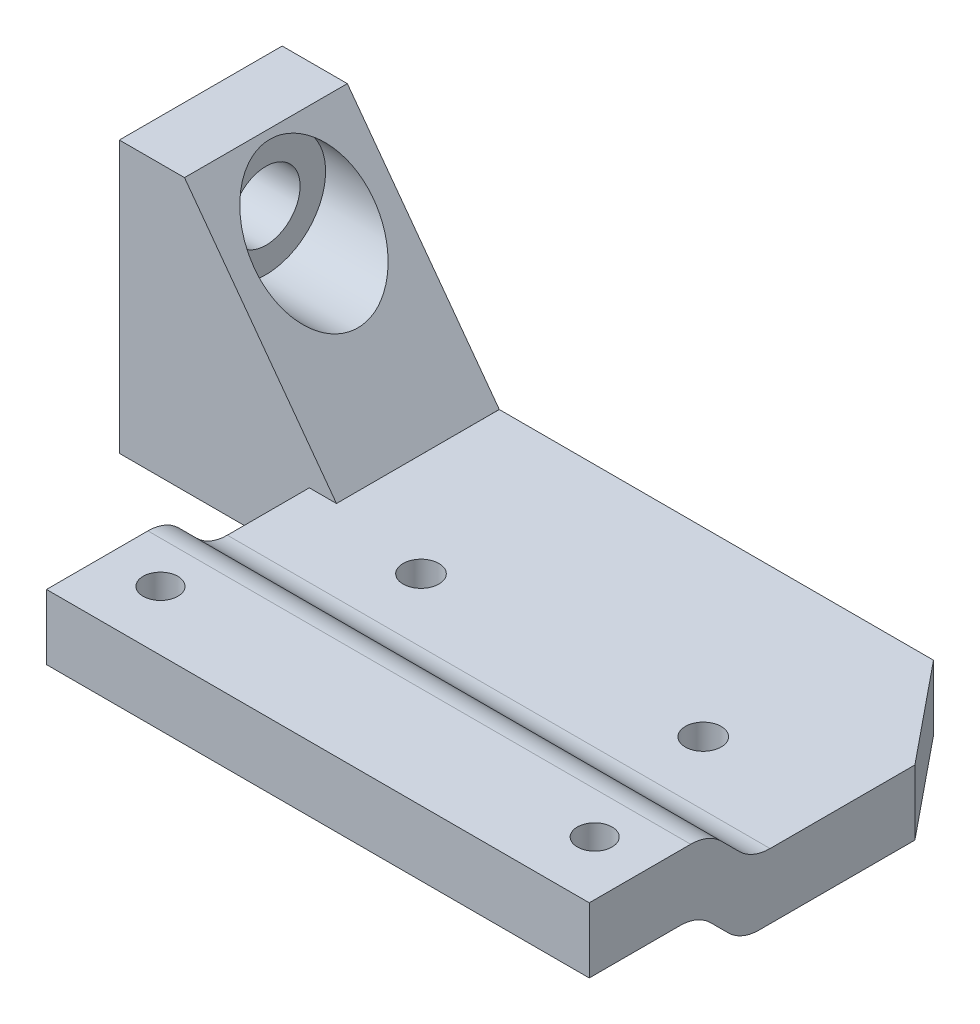
ISO-10303-21;
HEADER;
FILE_DESCRIPTION(('STEP AP214'),'2;1');
FILE_NAME('part.step','',(''),(''),'','','');
FILE_SCHEMA(('AUTOMOTIVE_DESIGN { 1 0 10303 214 1 1 1 1 }'));
ENDSEC;
DATA;
#1=APPLICATION_CONTEXT('core data for automotive mechanical design processes');
#2=APPLICATION_PROTOCOL_DEFINITION('international standard','automotive_design',2000,#1);
#3=PRODUCT_CONTEXT('',#1,'mechanical');
#4=PRODUCT('Part','Part','',(#3));
#5=PRODUCT_RELATED_PRODUCT_CATEGORY('part','',(#4));
#6=PRODUCT_DEFINITION_FORMATION('','',#4);
#7=PRODUCT_DEFINITION_CONTEXT('part definition',#1,'design');
#8=PRODUCT_DEFINITION('design','',#6,#7);
#9=PRODUCT_DEFINITION_SHAPE('','',#8);
#10=(LENGTH_UNIT() NAMED_UNIT(*) SI_UNIT(.MILLI.,.METRE.));
#11=(NAMED_UNIT(*) PLANE_ANGLE_UNIT() SI_UNIT($,.RADIAN.));
#12=(NAMED_UNIT(*) SI_UNIT($,.STERADIAN.) SOLID_ANGLE_UNIT());
#13=UNCERTAINTY_MEASURE_WITH_UNIT(LENGTH_MEASURE(1.E-05),#10,'distance_accuracy_value','');
#14=(GEOMETRIC_REPRESENTATION_CONTEXT(3) GLOBAL_UNCERTAINTY_ASSIGNED_CONTEXT((#13)) GLOBAL_UNIT_ASSIGNED_CONTEXT((#10,
#11,#12)) REPRESENTATION_CONTEXT('',''));
#15=CARTESIAN_POINT('',(0.,0.,0.));
#16=DIRECTION('',(0.,0.,1.));
#17=DIRECTION('',(1.,0.,0.));
#18=AXIS2_PLACEMENT_3D('',#15,#16,#17);
#19=CARTESIAN_POINT('',(0.,6.,0.));
#20=DIRECTION('',(0.,1.,0.));
#21=DIRECTION('',(0.,0.,1.));
#22=AXIS2_PLACEMENT_3D('',#19,#20,#21);
#23=PLANE('',#22);
#24=CARTESIAN_POINT('',(13.,6.,0.));
#25=DIRECTION('',(0.,1.,0.));
#26=DIRECTION('',(0.,0.,1.));
#27=AXIS2_PLACEMENT_3D('',#24,#25,#26);
#28=CIRCLE('',#27,1.65);
#29=CARTESIAN_POINT('',(13.,6.,1.65));
#30=VERTEX_POINT('',#29);
#31=EDGE_CURVE('E253',#30,#30,#28,.T.);
#32=ORIENTED_EDGE('',*,*,#31,.F.);
#33=EDGE_LOOP('',(#32));
#34=FACE_BOUND('',#33,.T.);
#35=CARTESIAN_POINT('',(-13.,6.,0.));
#36=DIRECTION('',(0.,1.,0.));
#37=DIRECTION('',(0.,0.,1.));
#38=AXIS2_PLACEMENT_3D('',#35,#36,#37);
#39=CIRCLE('',#38,1.65);
#40=CARTESIAN_POINT('',(-13.,6.,1.65));
#41=VERTEX_POINT('',#40);
#42=EDGE_CURVE('E257',#41,#41,#39,.T.);
#43=ORIENTED_EDGE('',*,*,#42,.F.);
#44=EDGE_LOOP('',(#43));
#45=FACE_BOUND('',#44,.T.);
#46=DIRECTION('',(0.,0.,1.));
#47=VECTOR('',#46,1.);
#48=CARTESIAN_POINT('',(-25.,6.,0.));
#49=LINE('',#48,#47);
#50=CARTESIAN_POINT('',(-25.,6.,-1.71166189043959));
#51=VERTEX_POINT('',#50);
#52=CARTESIAN_POINT('',(-25.,6.,5.84314575050763));
#53=VERTEX_POINT('',#52);
#54=EDGE_CURVE('E237',#51,#53,#49,.T.);
#55=ORIENTED_EDGE('',*,*,#54,.T.);
#56=DIRECTION('',(1.,0.,0.));
#57=VECTOR('',#56,1.);
#58=CARTESIAN_POINT('',(25.,6.,5.84314575050762));
#59=LINE('',#58,#57);
#60=CARTESIAN_POINT('',(25.,6.,5.84314575050762));
#61=VERTEX_POINT('',#60);
#62=EDGE_CURVE('E358',#53,#61,#59,.T.);
#63=ORIENTED_EDGE('',*,*,#62,.T.);
#64=DIRECTION('',(0.,0.,1.));
#65=VECTOR('',#64,1.);
#66=CARTESIAN_POINT('',(25.,6.,0.));
#67=LINE('',#66,#65);
#68=CARTESIAN_POINT('',(25.,6.,-7.5));
#69=VERTEX_POINT('',#68);
#70=EDGE_CURVE('E241',#69,#61,#67,.T.);
#71=ORIENTED_EDGE('',*,*,#70,.F.);
#72=DIRECTION('',(0.63137953476849,0.,0.775473973177388));
#73=VECTOR('',#72,1.);
#74=CARTESIAN_POINT('',(18.7061350499617,6.,-15.2302607871789));
#75=LINE('',#74,#73);
#76=CARTESIAN_POINT('',(17.5,6.,-16.7116618904396));
#77=VERTEX_POINT('',#76);
#78=EDGE_CURVE('E246',#77,#69,#75,.T.);
#79=ORIENTED_EDGE('',*,*,#78,.F.);
#80=DIRECTION('',(1.,0.,0.));
#81=VECTOR('',#80,1.);
#82=CARTESIAN_POINT('',(0.,6.,-16.7116618904396));
#83=LINE('',#82,#81);
#84=CARTESIAN_POINT('',(-22.5000000000013,6.,-16.7116618904396));
#85=VERTEX_POINT('',#84);
#86=EDGE_CURVE('E250',#85,#77,#83,.T.);
#87=ORIENTED_EDGE('',*,*,#86,.F.);
#88=DIRECTION('',(0.,0.,1.));
#89=VECTOR('',#88,1.);
#90=CARTESIAN_POINT('',(-22.5000000000013,6.,0.));
#91=LINE('',#90,#89);
#92=CARTESIAN_POINT('',(-22.498631959725,6.,-1.71166189043959));
#93=VERTEX_POINT('',#92);
#94=EDGE_CURVE('E234',#85,#93,#91,.T.);
#95=ORIENTED_EDGE('',*,*,#94,.T.);
#96=DIRECTION('',(-1.,0.,0.));
#97=VECTOR('',#96,1.);
#98=CARTESIAN_POINT('',(0.,6.,-1.71166189043959));
#99=LINE('',#98,#97);
#100=EDGE_CURVE('E267',#93,#51,#99,.T.);
#101=ORIENTED_EDGE('',*,*,#100,.T.);
#102=EDGE_LOOP('',(#55,#63,#71,#79,#87,#95,#101));
#103=FACE_BOUND('',#102,.T.);
#104=ADVANCED_FACE('F46',(#34,#45,#103),#23,.T.);
#105=CARTESIAN_POINT('',(0.,6.,-1.71166189043959));
#106=DIRECTION('',(0.,0.,-1.));
#107=DIRECTION('',(-1.,0.,0.));
#108=AXIS2_PLACEMENT_3D('',#105,#106,#107);
#109=PLANE('',#108);
#110=ORIENTED_EDGE('',*,*,#100,.F.);
#111=DIRECTION('',(0.59319903804985,-0.805055837353368,0.));
#112=VECTOR('',#111,1.);
#113=CARTESIAN_POINT('',(-36.498631959725,25.,-1.71166189043959));
#114=LINE('',#113,#112);
#115=CARTESIAN_POINT('',(-36.498631959725,25.,-1.71166189043959));
#116=VERTEX_POINT('',#115);
#117=EDGE_CURVE('E212',#116,#93,#114,.T.);
#118=ORIENTED_EDGE('',*,*,#117,.F.);
#119=DIRECTION('',(-1.,0.,0.));
#120=VECTOR('',#119,1.);
#121=CARTESIAN_POINT('',(-22.5000000000013,25.,-1.71166189043959));
#122=LINE('',#121,#120);
#123=CARTESIAN_POINT('',(-42.5000000000013,25.,-1.71166189043959));
#124=VERTEX_POINT('',#123);
#125=EDGE_CURVE('E231',#116,#124,#122,.T.);
#126=ORIENTED_EDGE('',*,*,#125,.T.);
#127=DIRECTION('',(0.,-1.,0.));
#128=VECTOR('',#127,1.);
#129=CARTESIAN_POINT('',(-42.5000000000013,6.,-1.71166189043959));
#130=LINE('',#129,#128);
#131=CARTESIAN_POINT('',(-42.5000000000013,0.,-1.71166189043959));
#132=VERTEX_POINT('',#131);
#133=EDGE_CURVE('E261',#124,#132,#130,.T.);
#134=ORIENTED_EDGE('',*,*,#133,.T.);
#135=DIRECTION('',(1.,0.,0.));
#136=VECTOR('',#135,1.);
#137=CARTESIAN_POINT('',(0.,0.,-1.71166189043959));
#138=LINE('',#137,#136);
#139=CARTESIAN_POINT('',(-25.,0.,-1.71166189043959));
#140=VERTEX_POINT('',#139);
#141=EDGE_CURVE('E262',#132,#140,#138,.T.);
#142=ORIENTED_EDGE('',*,*,#141,.T.);
#143=DIRECTION('',(0.,-1.,0.));
#144=VECTOR('',#143,1.);
#145=CARTESIAN_POINT('',(-25.,6.,-1.71166189043959));
#146=LINE('',#145,#144);
#147=EDGE_CURVE('E304',#51,#140,#146,.T.);
#148=ORIENTED_EDGE('',*,*,#147,.F.);
#149=EDGE_LOOP('',(#110,#118,#126,#134,#142,#148));
#150=FACE_BOUND('',#149,.T.);
#151=ADVANCED_FACE('F410',(#150),#109,.F.);
#152=CARTESIAN_POINT('',(-25.,6.,0.));
#153=DIRECTION('',(1.,0.,0.));
#154=DIRECTION('',(0.,0.,-1.));
#155=AXIS2_PLACEMENT_3D('',#152,#153,#154);
#156=PLANE('',#155);
#157=DIRECTION('',(0.,0.,1.));
#158=VECTOR('',#157,1.);
#159=CARTESIAN_POINT('',(-25.,0.,0.));
#160=LINE('',#159,#158);
#161=CARTESIAN_POINT('',(-25.,0.,6.84314575050762));
#162=VERTEX_POINT('',#161);
#163=EDGE_CURVE('E266',#140,#162,#160,.T.);
#164=ORIENTED_EDGE('',*,*,#163,.T.);
#165=CARTESIAN_POINT('',(-25.,4.,6.84314575050762));
#166=DIRECTION('',(1.,0.,0.));
#167=DIRECTION('',(0.,0.,-1.));
#168=AXIS2_PLACEMENT_3D('',#165,#166,#167);
#169=CIRCLE('',#168,4.);
#170=CARTESIAN_POINT('',(-25.,1.17157287525382,9.67157287525381));
#171=VERTEX_POINT('',#170);
#172=EDGE_CURVE('E381',#162,#171,#169,.F.);
#173=ORIENTED_EDGE('',*,*,#172,.T.);
#174=DIRECTION('',(0.,-0.707106781186549,-0.707106781186546));
#175=VECTOR('',#174,1.);
#176=CARTESIAN_POINT('',(-25.,0.,8.5));
#177=LINE('',#176,#175);
#178=CARTESIAN_POINT('',(-25.,2.82842712474619,11.3284271247462));
#179=VERTEX_POINT('',#178);
#180=EDGE_CURVE('E368',#171,#179,#177,.F.);
#181=ORIENTED_EDGE('',*,*,#180,.T.);
#182=CARTESIAN_POINT('',(-25.,0.,14.1568542494924));
#183=DIRECTION('',(1.,0.,0.));
#184=DIRECTION('',(0.,0.,-1.));
#185=AXIS2_PLACEMENT_3D('',#182,#183,#184);
#186=CIRCLE('',#185,4.);
#187=CARTESIAN_POINT('',(-25.,4.,14.1568542494924));
#188=VERTEX_POINT('',#187);
#189=EDGE_CURVE('E55',#179,#188,#186,.T.);
#190=ORIENTED_EDGE('',*,*,#189,.T.);
#191=DIRECTION('',(0.,0.,-1.));
#192=VECTOR('',#191,1.);
#193=CARTESIAN_POINT('',(-25.,4.,12.5));
#194=LINE('',#193,#192);
#195=CARTESIAN_POINT('',(-25.,4.,22.5));
#196=VERTEX_POINT('',#195);
#197=EDGE_CURVE('E169',#196,#188,#194,.T.);
#198=ORIENTED_EDGE('',*,*,#197,.F.);
#199=DIRECTION('',(0.,-1.,0.));
#200=VECTOR('',#199,1.);
#201=CARTESIAN_POINT('',(-25.,9.99999999999999,22.5));
#202=LINE('',#201,#200);
#203=CARTESIAN_POINT('',(-25.,9.99999999999999,22.5));
#204=VERTEX_POINT('',#203);
#205=EDGE_CURVE('E181',#204,#196,#202,.T.);
#206=ORIENTED_EDGE('',*,*,#205,.F.);
#207=DIRECTION('',(0.,0.,-1.));
#208=VECTOR('',#207,1.);
#209=CARTESIAN_POINT('',(-25.,9.99999999999999,22.5));
#210=LINE('',#209,#208);
#211=CARTESIAN_POINT('',(-25.,9.99999999999999,13.1568542494924));
#212=VERTEX_POINT('',#211);
#213=EDGE_CURVE('E189',#204,#212,#210,.T.);
#214=ORIENTED_EDGE('',*,*,#213,.T.);
#215=CARTESIAN_POINT('',(-25.,5.99999999999999,13.1568542494924));
#216=DIRECTION('',(1.,0.,0.));
#217=DIRECTION('',(0.,0.,-1.));
#218=AXIS2_PLACEMENT_3D('',#215,#216,#217);
#219=CIRCLE('',#218,4.);
#220=CARTESIAN_POINT('',(-25.,8.82842712474618,10.3284271247462));
#221=VERTEX_POINT('',#220);
#222=EDGE_CURVE('E346',#212,#221,#219,.F.);
#223=ORIENTED_EDGE('',*,*,#222,.T.);
#224=DIRECTION('',(0.,-0.707106781186549,-0.707106781186546));
#225=VECTOR('',#224,1.);
#226=CARTESIAN_POINT('',(-25.,10.,11.5));
#227=LINE('',#226,#225);
#228=CARTESIAN_POINT('',(-25.,7.17157287525381,8.67157287525382));
#229=VERTEX_POINT('',#228);
#230=EDGE_CURVE('E317',#221,#229,#227,.T.);
#231=ORIENTED_EDGE('',*,*,#230,.T.);
#232=CARTESIAN_POINT('',(-25.,10.,5.84314575050763));
#233=DIRECTION('',(1.,0.,0.));
#234=DIRECTION('',(0.,0.,-1.));
#235=AXIS2_PLACEMENT_3D('',#232,#233,#234);
#236=CIRCLE('',#235,4.);
#237=EDGE_CURVE('E365',#229,#53,#236,.T.);
#238=ORIENTED_EDGE('',*,*,#237,.T.);
#239=ORIENTED_EDGE('',*,*,#54,.F.);
#240=ORIENTED_EDGE('',*,*,#147,.T.);
#241=EDGE_LOOP('',(#164,#173,#181,#190,#198,#206,#214,#223,#231,#238,#239,#240));
#242=FACE_BOUND('',#241,.T.);
#243=ADVANCED_FACE('F179',(#242),#156,.F.);
#244=CARTESIAN_POINT('',(25.,6.,0.));
#245=DIRECTION('',(1.,0.,0.));
#246=DIRECTION('',(0.,0.,-1.));
#247=AXIS2_PLACEMENT_3D('',#244,#245,#246);
#248=PLANE('',#247);
#249=DIRECTION('',(0.,0.,-1.));
#250=VECTOR('',#249,1.);
#251=CARTESIAN_POINT('',(25.,4.,12.5));
#252=LINE('',#251,#250);
#253=CARTESIAN_POINT('',(25.,4.,22.5));
#254=VERTEX_POINT('',#253);
#255=CARTESIAN_POINT('',(25.,4.,14.1568542494924));
#256=VERTEX_POINT('',#255);
#257=EDGE_CURVE('E170',#254,#256,#252,.T.);
#258=ORIENTED_EDGE('',*,*,#257,.T.);
#259=CARTESIAN_POINT('',(25.,0.,14.1568542494924));
#260=DIRECTION('',(1.,0.,0.));
#261=DIRECTION('',(0.,0.,-1.));
#262=AXIS2_PLACEMENT_3D('',#259,#260,#261);
#263=CIRCLE('',#262,4.);
#264=CARTESIAN_POINT('',(25.,2.82842712474618,11.3284271247462));
#265=VERTEX_POINT('',#264);
#266=EDGE_CURVE('E11',#256,#265,#263,.F.);
#267=ORIENTED_EDGE('',*,*,#266,.T.);
#268=DIRECTION('',(0.,0.707106781186549,0.707106781186546));
#269=VECTOR('',#268,1.);
#270=CARTESIAN_POINT('',(25.,-1.24999999999999,7.25000000000002));
#271=LINE('',#270,#269);
#272=CARTESIAN_POINT('',(25.,1.17157287525381,9.67157287525382));
#273=VERTEX_POINT('',#272);
#274=EDGE_CURVE('E374',#265,#273,#271,.F.);
#275=ORIENTED_EDGE('',*,*,#274,.T.);
#276=CARTESIAN_POINT('',(25.,4.,6.84314575050762));
#277=DIRECTION('',(1.,0.,0.));
#278=DIRECTION('',(0.,0.,-1.));
#279=AXIS2_PLACEMENT_3D('',#276,#277,#278);
#280=CIRCLE('',#279,4.);
#281=CARTESIAN_POINT('',(25.,0.,6.84314575050762));
#282=VERTEX_POINT('',#281);
#283=EDGE_CURVE('E388',#273,#282,#280,.T.);
#284=ORIENTED_EDGE('',*,*,#283,.T.);
#285=DIRECTION('',(0.,0.,1.));
#286=VECTOR('',#285,1.);
#287=CARTESIAN_POINT('',(25.,0.,0.));
#288=LINE('',#287,#286);
#289=CARTESIAN_POINT('',(25.,0.,-7.5));
#290=VERTEX_POINT('',#289);
#291=EDGE_CURVE('E270',#290,#282,#288,.T.);
#292=ORIENTED_EDGE('',*,*,#291,.F.);
#293=DIRECTION('',(0.,-1.,0.));
#294=VECTOR('',#293,1.);
#295=CARTESIAN_POINT('',(25.,6.,-7.5));
#296=LINE('',#295,#294);
#297=EDGE_CURVE('E301',#69,#290,#296,.T.);
#298=ORIENTED_EDGE('',*,*,#297,.F.);
#299=ORIENTED_EDGE('',*,*,#70,.T.);
#300=CARTESIAN_POINT('',(25.,10.,5.84314575050762));
#301=DIRECTION('',(1.,0.,0.));
#302=DIRECTION('',(0.,0.,-1.));
#303=AXIS2_PLACEMENT_3D('',#300,#301,#302);
#304=CIRCLE('',#303,4.);
#305=CARTESIAN_POINT('',(25.,7.17157287525381,8.67157287525381));
#306=VERTEX_POINT('',#305);
#307=EDGE_CURVE('E362',#61,#306,#304,.F.);
#308=ORIENTED_EDGE('',*,*,#307,.T.);
#309=DIRECTION('',(0.,0.707106781186549,0.707106781186546));
#310=VECTOR('',#309,1.);
#311=CARTESIAN_POINT('',(25.,2.25,3.75000000000002));
#312=LINE('',#311,#310);
#313=CARTESIAN_POINT('',(25.,8.82842712474619,10.3284271247462));
#314=VERTEX_POINT('',#313);
#315=EDGE_CURVE('E338',#306,#314,#312,.T.);
#316=ORIENTED_EDGE('',*,*,#315,.T.);
#317=CARTESIAN_POINT('',(25.,6.,13.1568542494924));
#318=DIRECTION('',(1.,0.,0.));
#319=DIRECTION('',(0.,0.,-1.));
#320=AXIS2_PLACEMENT_3D('',#317,#318,#319);
#321=CIRCLE('',#320,4.);
#322=CARTESIAN_POINT('',(25.,10.,13.1568542494924));
#323=VERTEX_POINT('',#322);
#324=EDGE_CURVE('E355',#314,#323,#321,.T.);
#325=ORIENTED_EDGE('',*,*,#324,.T.);
#326=DIRECTION('',(0.,0.,-1.));
#327=VECTOR('',#326,1.);
#328=CARTESIAN_POINT('',(25.,10.,22.5));
#329=LINE('',#328,#327);
#330=CARTESIAN_POINT('',(25.,10.,22.5));
#331=VERTEX_POINT('',#330);
#332=EDGE_CURVE('E193',#331,#323,#329,.T.);
#333=ORIENTED_EDGE('',*,*,#332,.F.);
#334=DIRECTION('',(0.,1.,0.));
#335=VECTOR('',#334,1.);
#336=CARTESIAN_POINT('',(25.,10.,22.5));
#337=LINE('',#336,#335);
#338=EDGE_CURVE('E195',#254,#331,#337,.T.);
#339=ORIENTED_EDGE('',*,*,#338,.F.);
#340=EDGE_LOOP('',(#258,#267,#275,#284,#292,#298,#299,#308,#316,#325,#333,#339));
#341=FACE_BOUND('',#340,.T.);
#342=ADVANCED_FACE('F436',(#341),#248,.T.);
#343=CARTESIAN_POINT('',(18.7061350499617,6.,-15.2302607871789));
#344=DIRECTION('',(0.775473973177388,0.,-0.63137953476849));
#345=DIRECTION('',(-0.63137953476849,0.,-0.775473973177388));
#346=AXIS2_PLACEMENT_3D('',#343,#344,#345);
#347=PLANE('',#346);
#348=DIRECTION('',(0.63137953476849,0.,0.775473973177388));
#349=VECTOR('',#348,1.);
#350=CARTESIAN_POINT('',(18.7061350499617,0.,-15.2302607871789));
#351=LINE('',#350,#349);
#352=CARTESIAN_POINT('',(17.5,0.,-16.7116618904396));
#353=VERTEX_POINT('',#352);
#354=EDGE_CURVE('E274',#353,#290,#351,.T.);
#355=ORIENTED_EDGE('',*,*,#354,.F.);
#356=DIRECTION('',(0.,-1.,0.));
#357=VECTOR('',#356,1.);
#358=CARTESIAN_POINT('',(17.5,6.,-16.7116618904396));
#359=LINE('',#358,#357);
#360=EDGE_CURVE('E297',#77,#353,#359,.T.);
#361=ORIENTED_EDGE('',*,*,#360,.F.);
#362=ORIENTED_EDGE('',*,*,#78,.T.);
#363=ORIENTED_EDGE('',*,*,#297,.T.);
#364=EDGE_LOOP('',(#355,#361,#362,#363));
#365=FACE_BOUND('',#364,.T.);
#366=ADVANCED_FACE('F492',(#365),#347,.T.);
#367=CARTESIAN_POINT('',(0.,6.,-16.7116618904396));
#368=DIRECTION('',(0.,0.,-1.));
#369=DIRECTION('',(-1.,0.,0.));
#370=AXIS2_PLACEMENT_3D('',#367,#368,#369);
#371=PLANE('',#370);
#372=DIRECTION('',(0.59319903804985,-0.805055837353368,0.));
#373=VECTOR('',#372,1.);
#374=CARTESIAN_POINT('',(-36.498631959725,25.,-16.7116618904396));
#375=LINE('',#374,#373);
#376=CARTESIAN_POINT('',(-36.498631959725,25.,-16.7116618904396));
#377=VERTEX_POINT('',#376);
#378=CARTESIAN_POINT('',(-22.5000000000013,6.00185662608921,-16.7116618904396));
#379=VERTEX_POINT('',#378);
#380=EDGE_CURVE('E207',#377,#379,#375,.T.);
#381=ORIENTED_EDGE('',*,*,#380,.T.);
#382=DIRECTION('',(0.,-1.,0.));
#383=VECTOR('',#382,1.);
#384=CARTESIAN_POINT('',(-22.5000000000013,0.,-16.7116618904396));
#385=LINE('',#384,#383);
#386=EDGE_CURVE('E219',#379,#85,#385,.T.);
#387=ORIENTED_EDGE('',*,*,#386,.T.);
#388=ORIENTED_EDGE('',*,*,#86,.T.);
#389=ORIENTED_EDGE('',*,*,#360,.T.);
#390=DIRECTION('',(1.,0.,0.));
#391=VECTOR('',#390,1.);
#392=CARTESIAN_POINT('',(0.,0.,-16.7116618904396));
#393=LINE('',#392,#391);
#394=CARTESIAN_POINT('',(-42.5000000000013,0.,-16.7116618904396));
#395=VERTEX_POINT('',#394);
#396=EDGE_CURVE('E278',#395,#353,#393,.T.);
#397=ORIENTED_EDGE('',*,*,#396,.F.);
#398=DIRECTION('',(0.,-1.,0.));
#399=VECTOR('',#398,1.);
#400=CARTESIAN_POINT('',(-42.5000000000013,6.,-16.7116618904396));
#401=LINE('',#400,#399);
#402=CARTESIAN_POINT('',(-42.5000000000013,25.,-16.7116618904396));
#403=VERTEX_POINT('',#402);
#404=EDGE_CURVE('E294',#403,#395,#401,.T.);
#405=ORIENTED_EDGE('',*,*,#404,.F.);
#406=DIRECTION('',(-1.,0.,0.));
#407=VECTOR('',#406,1.);
#408=CARTESIAN_POINT('',(-22.5000000000013,25.,-16.7116618904396));
#409=LINE('',#408,#407);
#410=EDGE_CURVE('E222',#377,#403,#409,.T.);
#411=ORIENTED_EDGE('',*,*,#410,.F.);
#412=EDGE_LOOP('',(#381,#387,#388,#389,#397,#405,#411));
#413=FACE_BOUND('',#412,.T.);
#414=ADVANCED_FACE('F486',(#413),#371,.T.);
#415=CARTESIAN_POINT('',(13.,6.,0.));
#416=DIRECTION('',(0.,-1.,0.));
#417=DIRECTION('',(0.,0.,-1.));
#418=AXIS2_PLACEMENT_3D('',#415,#416,#417);
#419=CYLINDRICAL_SURFACE('',#418,1.65);
#420=ORIENTED_EDGE('',*,*,#31,.T.);
#421=EDGE_LOOP('',(#420));
#422=FACE_BOUND('',#421,.T.);
#423=CARTESIAN_POINT('',(13.,0.,0.));
#424=DIRECTION('',(0.,1.,0.));
#425=DIRECTION('',(0.,0.,1.));
#426=AXIS2_PLACEMENT_3D('',#423,#424,#425);
#427=CIRCLE('',#426,1.65);
#428=CARTESIAN_POINT('',(13.,0.,1.65));
#429=VERTEX_POINT('',#428);
#430=EDGE_CURVE('E284',#429,#429,#427,.T.);
#431=ORIENTED_EDGE('',*,*,#430,.F.);
#432=EDGE_LOOP('',(#431));
#433=FACE_BOUND('',#432,.T.);
#434=ADVANCED_FACE('F483',(#422,#433),#419,.F.);
#435=CARTESIAN_POINT('',(-42.5000000000013,6.,0.));
#436=DIRECTION('',(1.,0.,0.));
#437=DIRECTION('',(0.,0.,-1.));
#438=AXIS2_PLACEMENT_3D('',#435,#436,#437);
#439=PLANE('',#438);
#440=DIRECTION('',(0.,0.,1.));
#441=VECTOR('',#440,1.);
#442=CARTESIAN_POINT('',(-42.5000000000013,0.,0.));
#443=LINE('',#442,#441);
#444=EDGE_CURVE('E281',#395,#132,#443,.T.);
#445=ORIENTED_EDGE('',*,*,#444,.T.);
#446=ORIENTED_EDGE('',*,*,#133,.F.);
#447=DIRECTION('',(0.,0.,1.));
#448=VECTOR('',#447,1.);
#449=CARTESIAN_POINT('',(-42.5000000000013,25.,0.));
#450=LINE('',#449,#448);
#451=EDGE_CURVE('E223',#403,#124,#450,.T.);
#452=ORIENTED_EDGE('',*,*,#451,.F.);
#453=ORIENTED_EDGE('',*,*,#404,.T.);
#454=EDGE_LOOP('',(#445,#446,#452,#453));
#455=FACE_BOUND('',#454,.T.);
#456=CARTESIAN_POINT('',(-42.5000000000013,19.,-9.21166189043959));
#457=DIRECTION('',(-1.,0.,0.));
#458=DIRECTION('',(0.,0.,1.));
#459=AXIS2_PLACEMENT_3D('',#456,#457,#458);
#460=CIRCLE('',#459,3.15);
#461=CARTESIAN_POINT('',(-42.5000000000013,19.,-6.06166189043959));
#462=VERTEX_POINT('',#461);
#463=EDGE_CURVE('E224',#462,#462,#460,.T.);
#464=ORIENTED_EDGE('',*,*,#463,.F.);
#465=EDGE_LOOP('',(#464));
#466=FACE_BOUND('',#465,.T.);
#467=ADVANCED_FACE('F417',(#455,#466),#439,.F.);
#468=CARTESIAN_POINT('',(-13.,6.,0.));
#469=DIRECTION('',(0.,-1.,0.));
#470=DIRECTION('',(0.,0.,-1.));
#471=AXIS2_PLACEMENT_3D('',#468,#469,#470);
#472=CYLINDRICAL_SURFACE('',#471,1.65);
#473=ORIENTED_EDGE('',*,*,#42,.T.);
#474=EDGE_LOOP('',(#473));
#475=FACE_BOUND('',#474,.T.);
#476=CARTESIAN_POINT('',(-13.,0.,0.));
#477=DIRECTION('',(0.,1.,0.));
#478=DIRECTION('',(0.,0.,1.));
#479=AXIS2_PLACEMENT_3D('',#476,#477,#478);
#480=CIRCLE('',#479,1.65);
#481=CARTESIAN_POINT('',(-13.,0.,1.65));
#482=VERTEX_POINT('',#481);
#483=EDGE_CURVE('E242',#482,#482,#480,.T.);
#484=ORIENTED_EDGE('',*,*,#483,.F.);
#485=EDGE_LOOP('',(#484));
#486=FACE_BOUND('',#485,.T.);
#487=ADVANCED_FACE('F479',(#475,#486),#472,.F.);
#488=CARTESIAN_POINT('',(0.,0.,0.));
#489=DIRECTION('',(0.,1.,0.));
#490=DIRECTION('',(0.,0.,1.));
#491=AXIS2_PLACEMENT_3D('',#488,#489,#490);
#492=PLANE('',#491);
#493=ORIENTED_EDGE('',*,*,#291,.T.);
#494=DIRECTION('',(1.,0.,0.));
#495=VECTOR('',#494,1.);
#496=CARTESIAN_POINT('',(-25.,0.,6.84314575050762));
#497=LINE('',#496,#495);
#498=EDGE_CURVE('E377',#282,#162,#497,.F.);
#499=ORIENTED_EDGE('',*,*,#498,.T.);
#500=ORIENTED_EDGE('',*,*,#163,.F.);
#501=ORIENTED_EDGE('',*,*,#141,.F.);
#502=ORIENTED_EDGE('',*,*,#444,.F.);
#503=ORIENTED_EDGE('',*,*,#396,.T.);
#504=ORIENTED_EDGE('',*,*,#354,.T.);
#505=EDGE_LOOP('',(#493,#499,#500,#501,#502,#503,#504));
#506=FACE_BOUND('',#505,.T.);
#507=ORIENTED_EDGE('',*,*,#483,.T.);
#508=EDGE_LOOP('',(#507));
#509=FACE_BOUND('',#508,.T.);
#510=ORIENTED_EDGE('',*,*,#430,.T.);
#511=EDGE_LOOP('',(#510));
#512=FACE_BOUND('',#511,.T.);
#513=ADVANCED_FACE('F422',(#506,#509,#512),#492,.F.);
#514=CARTESIAN_POINT('',(-22.5000000000013,25.,0.));
#515=DIRECTION('',(0.,-1.,0.));
#516=DIRECTION('',(0.,0.,-1.));
#517=AXIS2_PLACEMENT_3D('',#514,#515,#516);
#518=PLANE('',#517);
#519=ORIENTED_EDGE('',*,*,#125,.F.);
#520=DIRECTION('',(0.,0.,1.));
#521=VECTOR('',#520,1.);
#522=CARTESIAN_POINT('',(-36.498631959725,25.,-16.7116618904396));
#523=LINE('',#522,#521);
#524=EDGE_CURVE('E211',#377,#116,#523,.T.);
#525=ORIENTED_EDGE('',*,*,#524,.F.);
#526=ORIENTED_EDGE('',*,*,#410,.T.);
#527=ORIENTED_EDGE('',*,*,#451,.T.);
#528=EDGE_LOOP('',(#519,#525,#526,#527));
#529=FACE_BOUND('',#528,.T.);
#530=ADVANCED_FACE('F413',(#529),#518,.F.);
#531=CARTESIAN_POINT('',(-22.5000000000013,19.,-9.21166189043959));
#532=DIRECTION('',(-1.,0.,0.));
#533=DIRECTION('',(0.,0.,1.));
#534=AXIS2_PLACEMENT_3D('',#531,#532,#533);
#535=CYLINDRICAL_SURFACE('',#534,3.15);
#536=CARTESIAN_POINT('',(-36.5000000000013,19.,-9.21166189043959));
#537=DIRECTION('',(-1.,0.,0.));
#538=DIRECTION('',(0.,0.,1.));
#539=AXIS2_PLACEMENT_3D('',#536,#537,#538);
#540=CIRCLE('',#539,3.15);
#541=CARTESIAN_POINT('',(-36.5000000000013,19.,-6.06166189043959));
#542=VERTEX_POINT('',#541);
#543=EDGE_CURVE('E218',#542,#542,#540,.F.);
#544=ORIENTED_EDGE('',*,*,#543,.T.);
#545=EDGE_LOOP('',(#544));
#546=FACE_BOUND('',#545,.T.);
#547=ORIENTED_EDGE('',*,*,#463,.T.);
#548=EDGE_LOOP('',(#547));
#549=FACE_BOUND('',#548,.T.);
#550=ADVANCED_FACE('F475',(#546,#549),#535,.F.);
#551=CARTESIAN_POINT('',(-22.5000000000013,0.,0.));
#552=DIRECTION('',(-1.,0.,0.));
#553=DIRECTION('',(0.,0.,1.));
#554=AXIS2_PLACEMENT_3D('',#551,#552,#553);
#555=PLANE('',#554);
#556=ORIENTED_EDGE('',*,*,#386,.F.);
#557=DIRECTION('',(0.,0.,1.));
#558=VECTOR('',#557,1.);
#559=CARTESIAN_POINT('',(-22.5000000000013,6.0018566260892,0.));
#560=LINE('',#559,#558);
#561=EDGE_CURVE('E308',#379,#93,#560,.T.);
#562=ORIENTED_EDGE('',*,*,#561,.T.);
#563=ORIENTED_EDGE('',*,*,#94,.F.);
#564=EDGE_LOOP('',(#556,#562,#563));
#565=FACE_BOUND('',#564,.T.);
#566=ADVANCED_FACE('F535',(#565),#555,.F.);
#567=CARTESIAN_POINT('',(-36.498631959725,25.,-16.7116618904396));
#568=DIRECTION('',(-0.805055837353368,-0.59319903804985,0.));
#569=DIRECTION('',(0.59319903804985,-0.805055837353368,0.));
#570=AXIS2_PLACEMENT_3D('',#567,#568,#569);
#571=PLANE('',#570);
#572=CARTESIAN_POINT('',(-32.0775793281461,19.,-9.21166189043959));
#573=DIRECTION('',(-0.805055837353368,-0.59319903804985,0.));
#574=DIRECTION('',(-0.59319903804985,0.805055837353368,0.));
#575=AXIS2_PLACEMENT_3D('',#572,#573,#574);
#576=ELLIPSE('',#575,6.83182425964555,5.5);
#577=CARTESIAN_POINT('',(-36.1302109070934,24.5,-9.21166189043959));
#578=VERTEX_POINT('',#577);
#579=EDGE_CURVE('E206',#578,#578,#576,.T.);
#580=ORIENTED_EDGE('',*,*,#579,.T.);
#581=EDGE_LOOP('',(#580));
#582=FACE_BOUND('',#581,.T.);
#583=ORIENTED_EDGE('',*,*,#380,.F.);
#584=ORIENTED_EDGE('',*,*,#524,.T.);
#585=ORIENTED_EDGE('',*,*,#117,.T.);
#586=ORIENTED_EDGE('',*,*,#561,.F.);
#587=EDGE_LOOP('',(#583,#584,#585,#586));
#588=FACE_BOUND('',#587,.T.);
#589=ADVANCED_FACE('F404',(#582,#588),#571,.F.);
#590=CARTESIAN_POINT('',(-36.5000000000013,19.,-9.21166189043959));
#591=DIRECTION('',(-1.,0.,0.));
#592=DIRECTION('',(0.,0.,1.));
#593=AXIS2_PLACEMENT_3D('',#590,#591,#592);
#594=PLANE('',#593);
#595=CARTESIAN_POINT('',(-36.5000000000013,19.,-9.21166189043959));
#596=DIRECTION('',(-1.,0.,0.));
#597=DIRECTION('',(0.,0.,1.));
#598=AXIS2_PLACEMENT_3D('',#595,#596,#597);
#599=CIRCLE('',#598,5.5);
#600=CARTESIAN_POINT('',(-36.5000000000013,19.,-3.71166189043959));
#601=VERTEX_POINT('',#600);
#602=EDGE_CURVE('E202',#601,#601,#599,.T.);
#603=ORIENTED_EDGE('',*,*,#602,.F.);
#604=EDGE_LOOP('',(#603));
#605=FACE_BOUND('',#604,.T.);
#606=ORIENTED_EDGE('',*,*,#543,.F.);
#607=EDGE_LOOP('',(#606));
#608=FACE_BOUND('',#607,.T.);
#609=ADVANCED_FACE('F459',(#605,#608),#594,.F.);
#610=CARTESIAN_POINT('',(25.,19.,-9.21166189043959));
#611=DIRECTION('',(-1.,0.,0.));
#612=DIRECTION('',(0.,0.,1.));
#613=AXIS2_PLACEMENT_3D('',#610,#611,#612);
#614=CYLINDRICAL_SURFACE('',#613,5.5);
#615=ORIENTED_EDGE('',*,*,#602,.T.);
#616=EDGE_LOOP('',(#615));
#617=FACE_BOUND('',#616,.T.);
#618=ORIENTED_EDGE('',*,*,#579,.F.);
#619=EDGE_LOOP('',(#618));
#620=FACE_BOUND('',#619,.T.);
#621=ADVANCED_FACE('F449',(#617,#620),#614,.F.);
#622=CARTESIAN_POINT('',(25.,10.,22.5));
#623=DIRECTION('',(0.,-1.,0.));
#624=DIRECTION('',(1.,0.,0.));
#625=AXIS2_PLACEMENT_3D('',#622,#623,#624);
#626=PLANE('',#625);
#627=CARTESIAN_POINT('',(-20.,9.99999999999999,17.));
#628=DIRECTION('',(0.,-1.,0.));
#629=DIRECTION('',(1.,0.,0.));
#630=AXIS2_PLACEMENT_3D('',#627,#628,#629);
#631=CIRCLE('',#630,1.6);
#632=CARTESIAN_POINT('',(-18.4,9.99999999999999,17.));
#633=VERTEX_POINT('',#632);
#634=EDGE_CURVE('E330',#633,#633,#631,.T.);
#635=ORIENTED_EDGE('',*,*,#634,.T.);
#636=EDGE_LOOP('',(#635));
#637=FACE_BOUND('',#636,.T.);
#638=CARTESIAN_POINT('',(20.,10.,17.));
#639=DIRECTION('',(0.,-1.,0.));
#640=DIRECTION('',(1.,0.,0.));
#641=AXIS2_PLACEMENT_3D('',#638,#639,#640);
#642=CIRCLE('',#641,1.6);
#643=CARTESIAN_POINT('',(21.6,10.,17.));
#644=VERTEX_POINT('',#643);
#645=EDGE_CURVE('E326',#644,#644,#642,.T.);
#646=ORIENTED_EDGE('',*,*,#645,.T.);
#647=EDGE_LOOP('',(#646));
#648=FACE_BOUND('',#647,.T.);
#649=ORIENTED_EDGE('',*,*,#332,.T.);
#650=DIRECTION('',(-1.,0.,0.));
#651=VECTOR('',#650,1.);
#652=CARTESIAN_POINT('',(-25.,9.99999999999999,13.1568542494924));
#653=LINE('',#652,#651);
#654=EDGE_CURVE('E342',#323,#212,#653,.T.);
#655=ORIENTED_EDGE('',*,*,#654,.T.);
#656=ORIENTED_EDGE('',*,*,#213,.F.);
#657=DIRECTION('',(-1.,0.,0.));
#658=VECTOR('',#657,1.);
#659=CARTESIAN_POINT('',(25.,10.,22.5));
#660=LINE('',#659,#658);
#661=EDGE_CURVE('E186',#331,#204,#660,.T.);
#662=ORIENTED_EDGE('',*,*,#661,.F.);
#663=EDGE_LOOP('',(#649,#655,#656,#662));
#664=FACE_BOUND('',#663,.T.);
#665=ADVANCED_FACE('F447',(#637,#648,#664),#626,.F.);
#666=CARTESIAN_POINT('',(0.,0.,22.5));
#667=DIRECTION('',(0.,0.,-1.));
#668=DIRECTION('',(-1.,0.,0.));
#669=AXIS2_PLACEMENT_3D('',#666,#667,#668);
#670=PLANE('',#669);
#671=ORIENTED_EDGE('',*,*,#205,.T.);
#672=DIRECTION('',(-1.,0.,0.));
#673=VECTOR('',#672,1.);
#674=CARTESIAN_POINT('',(25.,4.,22.5));
#675=LINE('',#674,#673);
#676=EDGE_CURVE('E166',#254,#196,#675,.T.);
#677=ORIENTED_EDGE('',*,*,#676,.F.);
#678=ORIENTED_EDGE('',*,*,#338,.T.);
#679=ORIENTED_EDGE('',*,*,#661,.T.);
#680=EDGE_LOOP('',(#671,#677,#678,#679));
#681=FACE_BOUND('',#680,.T.);
#682=ADVANCED_FACE('F184',(#681),#670,.F.);
#683=CARTESIAN_POINT('',(20.,0.,17.));
#684=DIRECTION('',(0.,1.,0.));
#685=DIRECTION('',(0.,0.,1.));
#686=AXIS2_PLACEMENT_3D('',#683,#684,#685);
#687=CYLINDRICAL_SURFACE('',#686,1.6);
#688=CARTESIAN_POINT('',(20.,4.,17.));
#689=DIRECTION('',(0.,1.,0.));
#690=DIRECTION('',(0.,0.,1.));
#691=AXIS2_PLACEMENT_3D('',#688,#689,#690);
#692=CIRCLE('',#691,1.6);
#693=CARTESIAN_POINT('',(20.,4.,18.6));
#694=VERTEX_POINT('',#693);
#695=EDGE_CURVE('E331',#694,#694,#692,.F.);
#696=ORIENTED_EDGE('',*,*,#695,.T.);
#697=EDGE_LOOP('',(#696));
#698=FACE_BOUND('',#697,.T.);
#699=ORIENTED_EDGE('',*,*,#645,.F.);
#700=EDGE_LOOP('',(#699));
#701=FACE_BOUND('',#700,.T.);
#702=ADVANCED_FACE('F457',(#698,#701),#687,.F.);
#703=CARTESIAN_POINT('',(-20.,0.,17.));
#704=DIRECTION('',(0.,1.,0.));
#705=DIRECTION('',(0.,0.,1.));
#706=AXIS2_PLACEMENT_3D('',#703,#704,#705);
#707=CYLINDRICAL_SURFACE('',#706,1.6);
#708=CARTESIAN_POINT('',(-20.,4.,17.));
#709=DIRECTION('',(0.,1.,0.));
#710=DIRECTION('',(0.,0.,1.));
#711=AXIS2_PLACEMENT_3D('',#708,#709,#710);
#712=CIRCLE('',#711,1.6);
#713=CARTESIAN_POINT('',(-20.,4.,18.6));
#714=VERTEX_POINT('',#713);
#715=EDGE_CURVE('E175',#714,#714,#712,.F.);
#716=ORIENTED_EDGE('',*,*,#715,.T.);
#717=EDGE_LOOP('',(#716));
#718=FACE_BOUND('',#717,.T.);
#719=ORIENTED_EDGE('',*,*,#634,.F.);
#720=EDGE_LOOP('',(#719));
#721=FACE_BOUND('',#720,.T.);
#722=ADVANCED_FACE('F507',(#718,#721),#707,.F.);
#723=CARTESIAN_POINT('',(25.,10.,11.5));
#724=DIRECTION('',(0.,0.707106781186546,-0.707106781186549));
#725=DIRECTION('',(1.,0.,0.));
#726=AXIS2_PLACEMENT_3D('',#723,#724,#725);
#727=PLANE('',#726);
#728=ORIENTED_EDGE('',*,*,#230,.F.);
#729=DIRECTION('',(-1.,0.,0.));
#730=VECTOR('',#729,1.);
#731=CARTESIAN_POINT('',(25.,8.82842712474619,10.3284271247462));
#732=LINE('',#731,#730);
#733=EDGE_CURVE('E352',#221,#314,#732,.F.);
#734=ORIENTED_EDGE('',*,*,#733,.T.);
#735=ORIENTED_EDGE('',*,*,#315,.F.);
#736=DIRECTION('',(1.,0.,0.));
#737=VECTOR('',#736,1.);
#738=CARTESIAN_POINT('',(-25.,7.17157287525381,8.67157287525382));
#739=LINE('',#738,#737);
#740=EDGE_CURVE('E349',#306,#229,#739,.F.);
#741=ORIENTED_EDGE('',*,*,#740,.T.);
#742=EDGE_LOOP('',(#728,#734,#735,#741));
#743=FACE_BOUND('',#742,.T.);
#744=ADVANCED_FACE('F440',(#743),#727,.T.);
#745=CARTESIAN_POINT('',(25.,6.,13.1568542494924));
#746=DIRECTION('',(1.,0.,0.));
#747=DIRECTION('',(0.,1.,0.));
#748=AXIS2_PLACEMENT_3D('',#745,#746,#747);
#749=CYLINDRICAL_SURFACE('',#748,4.);
#750=ORIENTED_EDGE('',*,*,#324,.F.);
#751=ORIENTED_EDGE('',*,*,#733,.F.);
#752=ORIENTED_EDGE('',*,*,#222,.F.);
#753=ORIENTED_EDGE('',*,*,#654,.F.);
#754=EDGE_LOOP('',(#750,#751,#752,#753));
#755=FACE_BOUND('',#754,.T.);
#756=ADVANCED_FACE('F443',(#755),#749,.T.);
#757=CARTESIAN_POINT('',(0.,10.,5.84314575050762));
#758=DIRECTION('',(-1.,0.,0.));
#759=DIRECTION('',(0.,0.,1.));
#760=AXIS2_PLACEMENT_3D('',#757,#758,#759);
#761=CYLINDRICAL_SURFACE('',#760,4.);
#762=ORIENTED_EDGE('',*,*,#237,.F.);
#763=ORIENTED_EDGE('',*,*,#740,.F.);
#764=ORIENTED_EDGE('',*,*,#307,.F.);
#765=ORIENTED_EDGE('',*,*,#62,.F.);
#766=EDGE_LOOP('',(#762,#763,#764,#765));
#767=FACE_BOUND('',#766,.T.);
#768=ADVANCED_FACE('F432',(#767),#761,.F.);
#769=CARTESIAN_POINT('',(25.,4.,12.5));
#770=DIRECTION('',(0.,1.,0.));
#771=DIRECTION('',(0.,0.,1.));
#772=AXIS2_PLACEMENT_3D('',#769,#770,#771);
#773=PLANE('',#772);
#774=ORIENTED_EDGE('',*,*,#715,.F.);
#775=EDGE_LOOP('',(#774));
#776=FACE_BOUND('',#775,.T.);
#777=ORIENTED_EDGE('',*,*,#197,.T.);
#778=DIRECTION('',(1.,0.,0.));
#779=VECTOR('',#778,1.);
#780=CARTESIAN_POINT('',(25.,4.,14.1568542494924));
#781=LINE('',#780,#779);
#782=EDGE_CURVE('E62',#188,#256,#781,.T.);
#783=ORIENTED_EDGE('',*,*,#782,.T.);
#784=ORIENTED_EDGE('',*,*,#257,.F.);
#785=ORIENTED_EDGE('',*,*,#676,.T.);
#786=EDGE_LOOP('',(#777,#783,#784,#785));
#787=FACE_BOUND('',#786,.T.);
#788=ORIENTED_EDGE('',*,*,#695,.F.);
#789=EDGE_LOOP('',(#788));
#790=FACE_BOUND('',#789,.T.);
#791=ADVANCED_FACE('F167',(#776,#787,#790),#773,.F.);
#792=CARTESIAN_POINT('',(0.,0.,8.5));
#793=DIRECTION('',(0.,0.707106781186546,-0.707106781186549));
#794=DIRECTION('',(-1.,0.,0.));
#795=AXIS2_PLACEMENT_3D('',#792,#793,#794);
#796=PLANE('',#795);
#797=ORIENTED_EDGE('',*,*,#274,.F.);
#798=DIRECTION('',(-1.,0.,0.));
#799=VECTOR('',#798,1.);
#800=CARTESIAN_POINT('',(0.,2.82842712474618,11.3284271247462));
#801=LINE('',#800,#799);
#802=EDGE_CURVE('E391',#265,#179,#801,.T.);
#803=ORIENTED_EDGE('',*,*,#802,.T.);
#804=ORIENTED_EDGE('',*,*,#180,.F.);
#805=DIRECTION('',(-1.,0.,0.));
#806=VECTOR('',#805,1.);
#807=CARTESIAN_POINT('',(25.,1.17157287525382,9.67157287525381));
#808=LINE('',#807,#806);
#809=EDGE_CURVE('E384',#171,#273,#808,.F.);
#810=ORIENTED_EDGE('',*,*,#809,.T.);
#811=EDGE_LOOP('',(#797,#803,#804,#810));
#812=FACE_BOUND('',#811,.T.);
#813=ADVANCED_FACE('F512',(#812),#796,.F.);
#814=CARTESIAN_POINT('',(0.,4.,6.84314575050762));
#815=DIRECTION('',(-1.,0.,0.));
#816=DIRECTION('',(0.,0.,1.));
#817=AXIS2_PLACEMENT_3D('',#814,#815,#816);
#818=CYLINDRICAL_SURFACE('',#817,4.);
#819=ORIENTED_EDGE('',*,*,#283,.F.);
#820=ORIENTED_EDGE('',*,*,#809,.F.);
#821=ORIENTED_EDGE('',*,*,#172,.F.);
#822=ORIENTED_EDGE('',*,*,#498,.F.);
#823=EDGE_LOOP('',(#819,#820,#821,#822));
#824=FACE_BOUND('',#823,.T.);
#825=ADVANCED_FACE('F516',(#824),#818,.T.);
#826=CARTESIAN_POINT('',(0.,0.,14.1568542494924));
#827=DIRECTION('',(1.,0.,0.));
#828=DIRECTION('',(0.,0.,-1.));
#829=AXIS2_PLACEMENT_3D('',#826,#827,#828);
#830=CYLINDRICAL_SURFACE('',#829,4.);
#831=ORIENTED_EDGE('',*,*,#266,.F.);
#832=ORIENTED_EDGE('',*,*,#782,.F.);
#833=ORIENTED_EDGE('',*,*,#189,.F.);
#834=ORIENTED_EDGE('',*,*,#802,.F.);
#835=EDGE_LOOP('',(#831,#832,#833,#834));
#836=FACE_BOUND('',#835,.T.);
#837=ADVANCED_FACE('F48',(#836),#830,.F.);
#838=CLOSED_SHELL('',(#104,#151,#243,#342,#366,#414,#434,#467,#487,#513,#530,#550,#566,#589,
#609,#621,#665,#682,#702,#722,#744,#756,#768,#791,#813,#825,#837));
#839=MANIFOLD_SOLID_BREP('B2',#838);
#840=ADVANCED_BREP_SHAPE_REPRESENTATION('',(#18,#839),#14);
#841=SHAPE_DEFINITION_REPRESENTATION(#9,#840);
ENDSEC;
END-ISO-10303-21;
